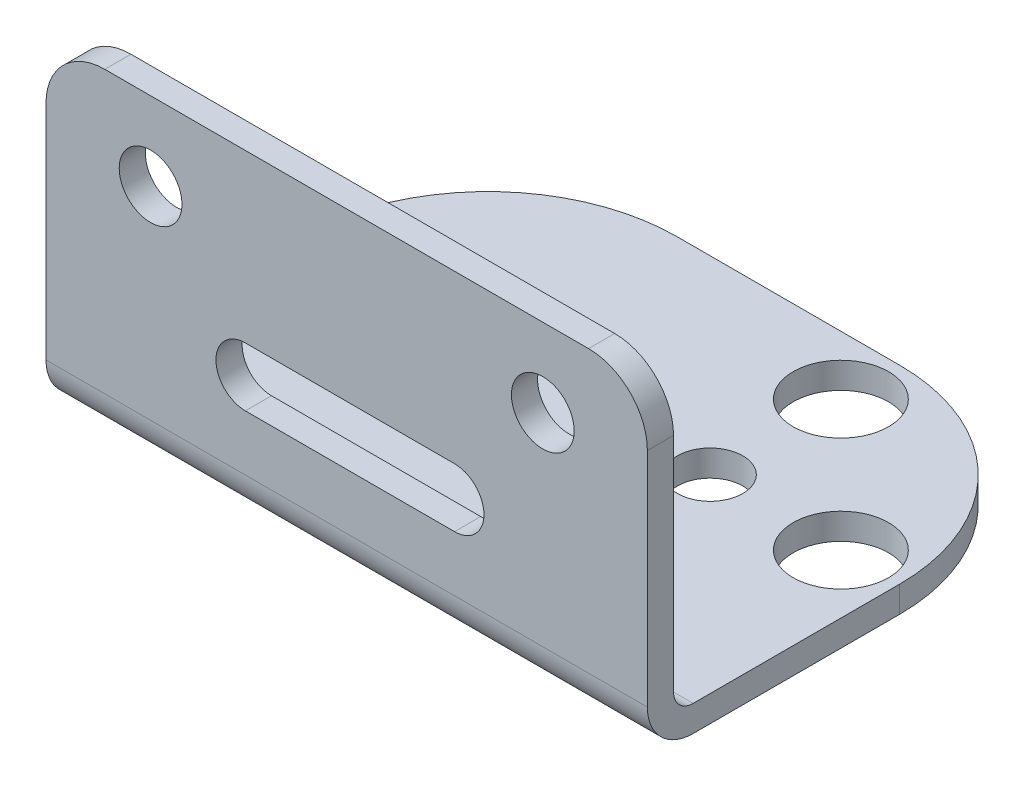
ISO-10303-21;
HEADER;
FILE_DESCRIPTION(('STEP AP214'),'2;1');
FILE_NAME('part.step','',(''),(''),'','','');
FILE_SCHEMA(('AUTOMOTIVE_DESIGN { 1 0 10303 214 1 1 1 1 }'));
ENDSEC;
DATA;
#1=APPLICATION_CONTEXT('core data for automotive mechanical design processes');
#2=APPLICATION_PROTOCOL_DEFINITION('international standard','automotive_design',2000,#1);
#3=PRODUCT_CONTEXT('',#1,'mechanical');
#4=PRODUCT('Part','Part','',(#3));
#5=PRODUCT_RELATED_PRODUCT_CATEGORY('part','',(#4));
#6=PRODUCT_DEFINITION_FORMATION('','',#4);
#7=PRODUCT_DEFINITION_CONTEXT('part definition',#1,'design');
#8=PRODUCT_DEFINITION('design','',#6,#7);
#9=PRODUCT_DEFINITION_SHAPE('','',#8);
#10=(LENGTH_UNIT() NAMED_UNIT(*) SI_UNIT(.MILLI.,.METRE.));
#11=(NAMED_UNIT(*) PLANE_ANGLE_UNIT() SI_UNIT($,.RADIAN.));
#12=(NAMED_UNIT(*) SI_UNIT($,.STERADIAN.) SOLID_ANGLE_UNIT());
#13=UNCERTAINTY_MEASURE_WITH_UNIT(LENGTH_MEASURE(1.E-05),#10,'distance_accuracy_value','');
#14=(GEOMETRIC_REPRESENTATION_CONTEXT(3) GLOBAL_UNCERTAINTY_ASSIGNED_CONTEXT((#13)) GLOBAL_UNIT_ASSIGNED_CONTEXT((#10,
#11,#12)) REPRESENTATION_CONTEXT('',''));
#15=CARTESIAN_POINT('',(0.,0.,0.));
#16=DIRECTION('',(0.,0.,1.));
#17=DIRECTION('',(1.,0.,0.));
#18=AXIS2_PLACEMENT_3D('',#15,#16,#17);
#19=CARTESIAN_POINT('',(0.,2.,-33.8));
#20=DIRECTION('',(1.,0.,0.));
#21=DIRECTION('',(0.,0.,-1.));
#22=AXIS2_PLACEMENT_3D('',#19,#20,#21);
#23=PLANE('',#22);
#24=DIRECTION('',(0.,0.,1.));
#25=VECTOR('',#24,1.);
#26=CARTESIAN_POINT('',(0.,0.,-33.8));
#27=LINE('',#26,#25);
#28=CARTESIAN_POINT('',(0.,0.,-19.3));
#29=VERTEX_POINT('',#28);
#30=CARTESIAN_POINT('',(0.,0.,-3.5));
#31=VERTEX_POINT('',#30);
#32=EDGE_CURVE('E253',#29,#31,#27,.T.);
#33=ORIENTED_EDGE('',*,*,#32,.T.);
#34=CARTESIAN_POINT('',(0.,3.5,-3.5));
#35=DIRECTION('',(1.,0.,0.));
#36=DIRECTION('',(0.,0.,-1.));
#37=AXIS2_PLACEMENT_3D('',#34,#35,#36);
#38=CIRCLE('',#37,3.5);
#39=CARTESIAN_POINT('',(0.,3.5,0.));
#40=VERTEX_POINT('',#39);
#41=EDGE_CURVE('E350',#31,#40,#38,.F.);
#42=ORIENTED_EDGE('',*,*,#41,.T.);
#43=DIRECTION('',(0.,-1.,0.));
#44=VECTOR('',#43,1.);
#45=CARTESIAN_POINT('',(0.,2.,0.));
#46=LINE('',#45,#44);
#47=CARTESIAN_POINT('',(0.,20.5,0.));
#48=VERTEX_POINT('',#47);
#49=EDGE_CURVE('E282',#48,#40,#46,.T.);
#50=ORIENTED_EDGE('',*,*,#49,.F.);
#51=DIRECTION('',(0.,0.,-1.));
#52=VECTOR('',#51,1.);
#53=CARTESIAN_POINT('',(0.,20.5,-2.00000000000001));
#54=LINE('',#53,#52);
#55=CARTESIAN_POINT('',(0.,20.5,-2.00000000000001));
#56=VERTEX_POINT('',#55);
#57=EDGE_CURVE('E314',#48,#56,#54,.T.);
#58=ORIENTED_EDGE('',*,*,#57,.T.);
#59=DIRECTION('',(0.,-1.,0.));
#60=VECTOR('',#59,1.);
#61=CARTESIAN_POINT('',(0.,25.,-2.00000000000001));
#62=LINE('',#61,#60);
#63=CARTESIAN_POINT('',(0.,3.5,-2.00000000000001));
#64=VERTEX_POINT('',#63);
#65=EDGE_CURVE('E208',#56,#64,#62,.T.);
#66=ORIENTED_EDGE('',*,*,#65,.T.);
#67=CARTESIAN_POINT('',(0.,3.5,-3.50000000000001));
#68=DIRECTION('',(1.,0.,0.));
#69=DIRECTION('',(0.,0.,-1.));
#70=AXIS2_PLACEMENT_3D('',#67,#68,#69);
#71=CIRCLE('',#70,1.5);
#72=CARTESIAN_POINT('',(0.,2.,-3.50000000000001));
#73=VERTEX_POINT('',#72);
#74=EDGE_CURVE('E360',#64,#73,#71,.T.);
#75=ORIENTED_EDGE('',*,*,#74,.T.);
#76=DIRECTION('',(0.,0.,1.));
#77=VECTOR('',#76,1.);
#78=CARTESIAN_POINT('',(0.,2.,-33.8));
#79=LINE('',#78,#77);
#80=CARTESIAN_POINT('',(0.,2.,-19.3));
#81=VERTEX_POINT('',#80);
#82=EDGE_CURVE('E257',#81,#73,#79,.T.);
#83=ORIENTED_EDGE('',*,*,#82,.F.);
#84=DIRECTION('',(0.,-1.,0.));
#85=VECTOR('',#84,1.);
#86=CARTESIAN_POINT('',(0.,2.,-19.3));
#87=LINE('',#86,#85);
#88=EDGE_CURVE('E286',#81,#29,#87,.T.);
#89=ORIENTED_EDGE('',*,*,#88,.T.);
#90=EDGE_LOOP('',(#33,#42,#50,#58,#66,#75,#83,#89));
#91=FACE_BOUND('',#90,.T.);
#92=ADVANCED_FACE('F42',(#91),#23,.F.);
#93=CARTESIAN_POINT('',(0.,2.,0.));
#94=DIRECTION('',(0.,0.,-1.));
#95=DIRECTION('',(-1.,0.,0.));
#96=AXIS2_PLACEMENT_3D('',#93,#94,#95);
#97=PLANE('',#96);
#98=DIRECTION('',(1.,0.,0.));
#99=VECTOR('',#98,1.);
#100=CARTESIAN_POINT('',(15.25,7.75,0.));
#101=LINE('',#100,#99);
#102=CARTESIAN_POINT('',(15.25,7.75,0.));
#103=VERTEX_POINT('',#102);
#104=CARTESIAN_POINT('',(31.25,7.75,0.));
#105=VERTEX_POINT('',#104);
#106=EDGE_CURVE('E168',#103,#105,#101,.T.);
#107=ORIENTED_EDGE('',*,*,#106,.F.);
#108=CARTESIAN_POINT('',(15.25,10.,0.));
#109=DIRECTION('',(0.,0.,1.));
#110=DIRECTION('',(-1.,0.,0.));
#111=AXIS2_PLACEMENT_3D('',#108,#109,#110);
#112=CIRCLE('',#111,2.25);
#113=CARTESIAN_POINT('',(15.25,12.25,0.));
#114=VERTEX_POINT('',#113);
#115=EDGE_CURVE('E58',#114,#103,#112,.T.);
#116=ORIENTED_EDGE('',*,*,#115,.F.);
#117=DIRECTION('',(-1.,0.,0.));
#118=VECTOR('',#117,1.);
#119=CARTESIAN_POINT('',(15.25,12.25,0.));
#120=LINE('',#119,#118);
#121=CARTESIAN_POINT('',(31.25,12.25,0.));
#122=VERTEX_POINT('',#121);
#123=EDGE_CURVE('E176',#122,#114,#120,.T.);
#124=ORIENTED_EDGE('',*,*,#123,.F.);
#125=CARTESIAN_POINT('',(31.25,10.,0.));
#126=DIRECTION('',(0.,0.,1.));
#127=DIRECTION('',(-1.,0.,0.));
#128=AXIS2_PLACEMENT_3D('',#125,#126,#127);
#129=CIRCLE('',#128,2.25);
#130=EDGE_CURVE('E158',#105,#122,#129,.T.);
#131=ORIENTED_EDGE('',*,*,#130,.F.);
#132=EDGE_LOOP('',(#107,#116,#124,#131));
#133=FACE_BOUND('',#132,.T.);
#134=CARTESIAN_POINT('',(38.,19.,0.));
#135=DIRECTION('',(0.,0.,1.));
#136=DIRECTION('',(-1.,0.,0.));
#137=AXIS2_PLACEMENT_3D('',#134,#135,#136);
#138=CIRCLE('',#137,2.4);
#139=CARTESIAN_POINT('',(35.6,19.,0.));
#140=VERTEX_POINT('',#139);
#141=EDGE_CURVE('E191',#140,#140,#138,.T.);
#142=ORIENTED_EDGE('',*,*,#141,.F.);
#143=EDGE_LOOP('',(#142));
#144=FACE_BOUND('',#143,.T.);
#145=CARTESIAN_POINT('',(8.,19.,0.));
#146=DIRECTION('',(0.,0.,1.));
#147=DIRECTION('',(-1.,0.,0.));
#148=AXIS2_PLACEMENT_3D('',#145,#146,#147);
#149=CIRCLE('',#148,2.4);
#150=CARTESIAN_POINT('',(5.6,19.,0.));
#151=VERTEX_POINT('',#150);
#152=EDGE_CURVE('E195',#151,#151,#149,.T.);
#153=ORIENTED_EDGE('',*,*,#152,.F.);
#154=EDGE_LOOP('',(#153));
#155=FACE_BOUND('',#154,.T.);
#156=ORIENTED_EDGE('',*,*,#49,.T.);
#157=DIRECTION('',(1.,0.,0.));
#158=VECTOR('',#157,1.);
#159=CARTESIAN_POINT('',(0.,3.5,0.));
#160=LINE('',#159,#158);
#161=CARTESIAN_POINT('',(46.,3.5,0.));
#162=VERTEX_POINT('',#161);
#163=EDGE_CURVE('E340',#40,#162,#160,.T.);
#164=ORIENTED_EDGE('',*,*,#163,.T.);
#165=DIRECTION('',(0.,-1.,0.));
#166=VECTOR('',#165,1.);
#167=CARTESIAN_POINT('',(46.,2.,0.));
#168=LINE('',#167,#166);
#169=CARTESIAN_POINT('',(46.,20.5,0.));
#170=VERTEX_POINT('',#169);
#171=EDGE_CURVE('E269',#170,#162,#168,.T.);
#172=ORIENTED_EDGE('',*,*,#171,.F.);
#173=CARTESIAN_POINT('',(41.5,20.5,0.));
#174=DIRECTION('',(0.,0.,-1.));
#175=DIRECTION('',(-1.,0.,0.));
#176=AXIS2_PLACEMENT_3D('',#173,#174,#175);
#177=CIRCLE('',#176,4.5);
#178=CARTESIAN_POINT('',(41.5,25.,0.));
#179=VERTEX_POINT('',#178);
#180=EDGE_CURVE('E330',#170,#179,#177,.F.);
#181=ORIENTED_EDGE('',*,*,#180,.T.);
#182=DIRECTION('',(-1.,0.,0.));
#183=VECTOR('',#182,1.);
#184=CARTESIAN_POINT('',(0.,25.,0.));
#185=LINE('',#184,#183);
#186=CARTESIAN_POINT('',(4.5,25.,0.));
#187=VERTEX_POINT('',#186);
#188=EDGE_CURVE('E203',#179,#187,#185,.T.);
#189=ORIENTED_EDGE('',*,*,#188,.T.);
#190=CARTESIAN_POINT('',(4.5,20.5,0.));
#191=DIRECTION('',(0.,0.,-1.));
#192=DIRECTION('',(-1.,0.,0.));
#193=AXIS2_PLACEMENT_3D('',#190,#191,#192);
#194=CIRCLE('',#193,4.5);
#195=EDGE_CURVE('E333',#187,#48,#194,.F.);
#196=ORIENTED_EDGE('',*,*,#195,.T.);
#197=EDGE_LOOP('',(#156,#164,#172,#181,#189,#196));
#198=FACE_BOUND('',#197,.T.);
#199=ADVANCED_FACE('F173',(#133,#144,#155,#198),#97,.F.);
#200=CARTESIAN_POINT('',(46.,2.,0.));
#201=DIRECTION('',(-1.,0.,0.));
#202=DIRECTION('',(0.,0.,1.));
#203=AXIS2_PLACEMENT_3D('',#200,#201,#202);
#204=PLANE('',#203);
#205=ORIENTED_EDGE('',*,*,#171,.T.);
#206=CARTESIAN_POINT('',(46.,3.5,-3.5));
#207=DIRECTION('',(-1.,0.,0.));
#208=DIRECTION('',(0.,0.,1.));
#209=AXIS2_PLACEMENT_3D('',#206,#207,#208);
#210=CIRCLE('',#209,3.5);
#211=CARTESIAN_POINT('',(46.,0.,-3.5));
#212=VERTEX_POINT('',#211);
#213=EDGE_CURVE('E344',#162,#212,#210,.F.);
#214=ORIENTED_EDGE('',*,*,#213,.T.);
#215=DIRECTION('',(0.,0.,-1.));
#216=VECTOR('',#215,1.);
#217=CARTESIAN_POINT('',(46.,0.,0.));
#218=LINE('',#217,#216);
#219=CARTESIAN_POINT('',(46.,0.,-19.3));
#220=VERTEX_POINT('',#219);
#221=EDGE_CURVE('E273',#212,#220,#218,.T.);
#222=ORIENTED_EDGE('',*,*,#221,.T.);
#223=DIRECTION('',(0.,-1.,0.));
#224=VECTOR('',#223,1.);
#225=CARTESIAN_POINT('',(46.,2.,-19.3));
#226=LINE('',#225,#224);
#227=CARTESIAN_POINT('',(46.,2.,-19.3));
#228=VERTEX_POINT('',#227);
#229=EDGE_CURVE('E310',#220,#228,#226,.F.);
#230=ORIENTED_EDGE('',*,*,#229,.T.);
#231=DIRECTION('',(0.,0.,-1.));
#232=VECTOR('',#231,1.);
#233=CARTESIAN_POINT('',(46.,2.,0.));
#234=LINE('',#233,#232);
#235=CARTESIAN_POINT('',(46.,2.,-3.5));
#236=VERTEX_POINT('',#235);
#237=EDGE_CURVE('E261',#236,#228,#234,.T.);
#238=ORIENTED_EDGE('',*,*,#237,.F.);
#239=CARTESIAN_POINT('',(46.,3.5,-3.5));
#240=DIRECTION('',(-1.,0.,0.));
#241=DIRECTION('',(0.,0.,1.));
#242=AXIS2_PLACEMENT_3D('',#239,#240,#241);
#243=CIRCLE('',#242,1.5);
#244=CARTESIAN_POINT('',(46.,3.5,-2.));
#245=VERTEX_POINT('',#244);
#246=EDGE_CURVE('E363',#236,#245,#243,.T.);
#247=ORIENTED_EDGE('',*,*,#246,.T.);
#248=DIRECTION('',(0.,-1.,0.));
#249=VECTOR('',#248,1.);
#250=CARTESIAN_POINT('',(46.,25.,-2.));
#251=LINE('',#250,#249);
#252=CARTESIAN_POINT('',(46.,20.5,-2.));
#253=VERTEX_POINT('',#252);
#254=EDGE_CURVE('E209',#253,#245,#251,.T.);
#255=ORIENTED_EDGE('',*,*,#254,.F.);
#256=DIRECTION('',(0.,0.,1.));
#257=VECTOR('',#256,1.);
#258=CARTESIAN_POINT('',(46.,20.5,0.));
#259=LINE('',#258,#257);
#260=EDGE_CURVE('E336',#253,#170,#259,.T.);
#261=ORIENTED_EDGE('',*,*,#260,.T.);
#262=EDGE_LOOP('',(#205,#214,#222,#230,#238,#247,#255,#261));
#263=FACE_BOUND('',#262,.T.);
#264=ADVANCED_FACE('F405',(#263),#204,.F.);
#265=CARTESIAN_POINT('',(46.,2.,-33.8));
#266=DIRECTION('',(0.,0.,1.));
#267=DIRECTION('',(1.,0.,0.));
#268=AXIS2_PLACEMENT_3D('',#265,#266,#267);
#269=PLANE('',#268);
#270=DIRECTION('',(-1.,0.,0.));
#271=VECTOR('',#270,1.);
#272=CARTESIAN_POINT('',(46.,0.,-33.8));
#273=LINE('',#272,#271);
#274=CARTESIAN_POINT('',(31.5,0.,-33.8));
#275=VERTEX_POINT('',#274);
#276=CARTESIAN_POINT('',(14.5,0.,-33.8));
#277=VERTEX_POINT('',#276);
#278=EDGE_CURVE('E262',#275,#277,#273,.T.);
#279=ORIENTED_EDGE('',*,*,#278,.T.);
#280=DIRECTION('',(0.,-1.,0.));
#281=VECTOR('',#280,1.);
#282=CARTESIAN_POINT('',(14.5,2.,-33.8));
#283=LINE('',#282,#281);
#284=CARTESIAN_POINT('',(14.5,2.,-33.8));
#285=VERTEX_POINT('',#284);
#286=EDGE_CURVE('E301',#277,#285,#283,.F.);
#287=ORIENTED_EDGE('',*,*,#286,.T.);
#288=DIRECTION('',(-1.,0.,0.));
#289=VECTOR('',#288,1.);
#290=CARTESIAN_POINT('',(46.,2.,-33.8));
#291=LINE('',#290,#289);
#292=CARTESIAN_POINT('',(31.5,2.,-33.8));
#293=VERTEX_POINT('',#292);
#294=EDGE_CURVE('E265',#293,#285,#291,.T.);
#295=ORIENTED_EDGE('',*,*,#294,.F.);
#296=DIRECTION('',(0.,-1.,0.));
#297=VECTOR('',#296,1.);
#298=CARTESIAN_POINT('',(31.5,2.,-33.8));
#299=LINE('',#298,#297);
#300=EDGE_CURVE('E297',#293,#275,#299,.T.);
#301=ORIENTED_EDGE('',*,*,#300,.T.);
#302=EDGE_LOOP('',(#279,#287,#295,#301));
#303=FACE_BOUND('',#302,.T.);
#304=ADVANCED_FACE('F473',(#303),#269,.F.);
#305=CARTESIAN_POINT('',(0.,2.,0.));
#306=DIRECTION('',(0.,1.,0.));
#307=DIRECTION('',(0.,0.,1.));
#308=AXIS2_PLACEMENT_3D('',#305,#306,#307);
#309=PLANE('',#308);
#310=ORIENTED_EDGE('',*,*,#82,.T.);
#311=DIRECTION('',(-1.,0.,0.));
#312=VECTOR('',#311,1.);
#313=CARTESIAN_POINT('',(46.,2.,-3.5));
#314=LINE('',#313,#312);
#315=EDGE_CURVE('E357',#73,#236,#314,.F.);
#316=ORIENTED_EDGE('',*,*,#315,.T.);
#317=ORIENTED_EDGE('',*,*,#237,.T.);
#318=CARTESIAN_POINT('',(31.5,2.,-19.3));
#319=DIRECTION('',(0.,1.,0.));
#320=DIRECTION('',(0.,0.,1.));
#321=AXIS2_PLACEMENT_3D('',#318,#319,#320);
#322=CIRCLE('',#321,14.5);
#323=EDGE_CURVE('E304',#228,#293,#322,.T.);
#324=ORIENTED_EDGE('',*,*,#323,.T.);
#325=ORIENTED_EDGE('',*,*,#294,.T.);
#326=CARTESIAN_POINT('',(14.5,2.,-19.3));
#327=DIRECTION('',(0.,1.,0.));
#328=DIRECTION('',(0.,0.,1.));
#329=AXIS2_PLACEMENT_3D('',#326,#327,#328);
#330=CIRCLE('',#329,14.5);
#331=EDGE_CURVE('E307',#285,#81,#330,.T.);
#332=ORIENTED_EDGE('',*,*,#331,.T.);
#333=EDGE_LOOP('',(#310,#316,#317,#324,#325,#332));
#334=FACE_BOUND('',#333,.T.);
#335=CARTESIAN_POINT('',(41.5,2.,-19.3));
#336=DIRECTION('',(0.,1.,0.));
#337=DIRECTION('',(0.,0.,1.));
#338=AXIS2_PLACEMENT_3D('',#335,#336,#337);
#339=CIRCLE('',#338,3.65);
#340=CARTESIAN_POINT('',(41.5,2.,-15.65));
#341=VERTEX_POINT('',#340);
#342=EDGE_CURVE('E233',#341,#341,#339,.T.);
#343=ORIENTED_EDGE('',*,*,#342,.F.);
#344=EDGE_LOOP('',(#343));
#345=FACE_BOUND('',#344,.T.);
#346=CARTESIAN_POINT('',(31.5,2.,-9.3));
#347=DIRECTION('',(0.,1.,0.));
#348=DIRECTION('',(0.,0.,1.));
#349=AXIS2_PLACEMENT_3D('',#346,#347,#348);
#350=CIRCLE('',#349,3.65);
#351=CARTESIAN_POINT('',(31.5,2.,-5.65));
#352=VERTEX_POINT('',#351);
#353=EDGE_CURVE('E242',#352,#352,#350,.T.);
#354=ORIENTED_EDGE('',*,*,#353,.F.);
#355=EDGE_LOOP('',(#354));
#356=FACE_BOUND('',#355,.T.);
#357=CARTESIAN_POINT('',(11.5,2.,-19.3));
#358=DIRECTION('',(0.,1.,0.));
#359=DIRECTION('',(0.,0.,1.));
#360=AXIS2_PLACEMENT_3D('',#357,#358,#359);
#361=CIRCLE('',#360,3.65);
#362=CARTESIAN_POINT('',(11.5,2.,-15.65));
#363=VERTEX_POINT('',#362);
#364=EDGE_CURVE('E217',#363,#363,#361,.T.);
#365=ORIENTED_EDGE('',*,*,#364,.F.);
#366=EDGE_LOOP('',(#365));
#367=FACE_BOUND('',#366,.T.);
#368=CARTESIAN_POINT('',(31.5,2.,-29.3));
#369=DIRECTION('',(0.,1.,0.));
#370=DIRECTION('',(0.,0.,1.));
#371=AXIS2_PLACEMENT_3D('',#368,#369,#370);
#372=CIRCLE('',#371,3.65);
#373=CARTESIAN_POINT('',(31.5,2.,-25.65));
#374=VERTEX_POINT('',#373);
#375=EDGE_CURVE('E226',#374,#374,#372,.T.);
#376=ORIENTED_EDGE('',*,*,#375,.F.);
#377=EDGE_LOOP('',(#376));
#378=FACE_BOUND('',#377,.T.);
#379=CARTESIAN_POINT('',(31.5,2.,-19.3));
#380=DIRECTION('',(0.,1.,0.));
#381=DIRECTION('',(0.,0.,1.));
#382=AXIS2_PLACEMENT_3D('',#379,#380,#381);
#383=CIRCLE('',#382,2.5);
#384=CARTESIAN_POINT('',(31.5,2.,-16.8));
#385=VERTEX_POINT('',#384);
#386=EDGE_CURVE('E237',#385,#385,#383,.T.);
#387=ORIENTED_EDGE('',*,*,#386,.F.);
#388=EDGE_LOOP('',(#387));
#389=FACE_BOUND('',#388,.T.);
#390=ADVANCED_FACE('F455',(#334,#345,#356,#367,#378,#389),#309,.T.);
#391=CARTESIAN_POINT('',(0.,0.,0.));
#392=DIRECTION('',(0.,1.,0.));
#393=DIRECTION('',(0.,0.,1.));
#394=AXIS2_PLACEMENT_3D('',#391,#392,#393);
#395=PLANE('',#394);
#396=CARTESIAN_POINT('',(41.5,0.,-19.3));
#397=DIRECTION('',(0.,1.,0.));
#398=DIRECTION('',(0.,0.,1.));
#399=AXIS2_PLACEMENT_3D('',#396,#397,#398);
#400=CIRCLE('',#399,3.65);
#401=CARTESIAN_POINT('',(41.5,0.,-15.65));
#402=VERTEX_POINT('',#401);
#403=EDGE_CURVE('E238',#402,#402,#400,.T.);
#404=ORIENTED_EDGE('',*,*,#403,.T.);
#405=EDGE_LOOP('',(#404));
#406=FACE_BOUND('',#405,.T.);
#407=CARTESIAN_POINT('',(31.5,0.,-9.3));
#408=DIRECTION('',(0.,1.,0.));
#409=DIRECTION('',(0.,0.,1.));
#410=AXIS2_PLACEMENT_3D('',#407,#408,#409);
#411=CIRCLE('',#410,3.65);
#412=CARTESIAN_POINT('',(31.5,0.,-5.65));
#413=VERTEX_POINT('',#412);
#414=EDGE_CURVE('E221',#413,#413,#411,.T.);
#415=ORIENTED_EDGE('',*,*,#414,.T.);
#416=EDGE_LOOP('',(#415));
#417=FACE_BOUND('',#416,.T.);
#418=CARTESIAN_POINT('',(11.5,0.,-19.3));
#419=DIRECTION('',(0.,1.,0.));
#420=DIRECTION('',(0.,0.,1.));
#421=AXIS2_PLACEMENT_3D('',#418,#419,#420);
#422=CIRCLE('',#421,3.65);
#423=CARTESIAN_POINT('',(11.5,0.,-15.65));
#424=VERTEX_POINT('',#423);
#425=EDGE_CURVE('E222',#424,#424,#422,.T.);
#426=ORIENTED_EDGE('',*,*,#425,.T.);
#427=EDGE_LOOP('',(#426));
#428=FACE_BOUND('',#427,.T.);
#429=CARTESIAN_POINT('',(31.5,0.,-29.3));
#430=DIRECTION('',(0.,1.,0.));
#431=DIRECTION('',(0.,0.,1.));
#432=AXIS2_PLACEMENT_3D('',#429,#430,#431);
#433=CIRCLE('',#432,3.65);
#434=CARTESIAN_POINT('',(31.5,0.,-25.65));
#435=VERTEX_POINT('',#434);
#436=EDGE_CURVE('E213',#435,#435,#433,.T.);
#437=ORIENTED_EDGE('',*,*,#436,.T.);
#438=EDGE_LOOP('',(#437));
#439=FACE_BOUND('',#438,.T.);
#440=CARTESIAN_POINT('',(31.5,0.,-19.3));
#441=DIRECTION('',(0.,1.,0.));
#442=DIRECTION('',(0.,0.,1.));
#443=AXIS2_PLACEMENT_3D('',#440,#441,#442);
#444=CIRCLE('',#443,2.5);
#445=CARTESIAN_POINT('',(31.5,0.,-16.8));
#446=VERTEX_POINT('',#445);
#447=EDGE_CURVE('E249',#446,#446,#444,.T.);
#448=ORIENTED_EDGE('',*,*,#447,.T.);
#449=EDGE_LOOP('',(#448));
#450=FACE_BOUND('',#449,.T.);
#451=ORIENTED_EDGE('',*,*,#221,.F.);
#452=DIRECTION('',(1.,0.,0.));
#453=VECTOR('',#452,1.);
#454=CARTESIAN_POINT('',(0.,0.,-3.5));
#455=LINE('',#454,#453);
#456=EDGE_CURVE('E347',#212,#31,#455,.F.);
#457=ORIENTED_EDGE('',*,*,#456,.T.);
#458=ORIENTED_EDGE('',*,*,#32,.F.);
#459=CARTESIAN_POINT('',(14.5,0.,-19.3));
#460=DIRECTION('',(0.,1.,0.));
#461=DIRECTION('',(0.,0.,1.));
#462=AXIS2_PLACEMENT_3D('',#459,#460,#461);
#463=CIRCLE('',#462,14.5);
#464=EDGE_CURVE('E294',#29,#277,#463,.F.);
#465=ORIENTED_EDGE('',*,*,#464,.T.);
#466=ORIENTED_EDGE('',*,*,#278,.F.);
#467=CARTESIAN_POINT('',(31.5,0.,-19.3));
#468=DIRECTION('',(0.,1.,0.));
#469=DIRECTION('',(0.,0.,1.));
#470=AXIS2_PLACEMENT_3D('',#467,#468,#469);
#471=CIRCLE('',#470,14.5);
#472=EDGE_CURVE('E290',#275,#220,#471,.F.);
#473=ORIENTED_EDGE('',*,*,#472,.T.);
#474=EDGE_LOOP('',(#451,#457,#458,#465,#466,#473));
#475=FACE_BOUND('',#474,.T.);
#476=ADVANCED_FACE('F413',(#406,#417,#428,#439,#450,#475),#395,.F.);
#477=CARTESIAN_POINT('',(14.5,2.,-19.3));
#478=DIRECTION('',(0.,-1.,0.));
#479=DIRECTION('',(0.,0.,-1.));
#480=AXIS2_PLACEMENT_3D('',#477,#478,#479);
#481=CYLINDRICAL_SURFACE('',#480,14.5);
#482=ORIENTED_EDGE('',*,*,#331,.F.);
#483=ORIENTED_EDGE('',*,*,#286,.F.);
#484=ORIENTED_EDGE('',*,*,#464,.F.);
#485=ORIENTED_EDGE('',*,*,#88,.F.);
#486=EDGE_LOOP('',(#482,#483,#484,#485));
#487=FACE_BOUND('',#486,.T.);
#488=ADVANCED_FACE('F409',(#487),#481,.T.);
#489=CARTESIAN_POINT('',(31.5,2.,-19.3));
#490=DIRECTION('',(0.,-1.,0.));
#491=DIRECTION('',(0.,0.,-1.));
#492=AXIS2_PLACEMENT_3D('',#489,#490,#491);
#493=CYLINDRICAL_SURFACE('',#492,14.5);
#494=ORIENTED_EDGE('',*,*,#323,.F.);
#495=ORIENTED_EDGE('',*,*,#229,.F.);
#496=ORIENTED_EDGE('',*,*,#472,.F.);
#497=ORIENTED_EDGE('',*,*,#300,.F.);
#498=EDGE_LOOP('',(#494,#495,#496,#497));
#499=FACE_BOUND('',#498,.T.);
#500=ADVANCED_FACE('F412',(#499),#493,.T.);
#501=CARTESIAN_POINT('',(31.5,0.,-19.3));
#502=DIRECTION('',(0.,1.,0.));
#503=DIRECTION('',(0.,0.,1.));
#504=AXIS2_PLACEMENT_3D('',#501,#502,#503);
#505=CYLINDRICAL_SURFACE('',#504,2.5);
#506=ORIENTED_EDGE('',*,*,#447,.F.);
#507=EDGE_LOOP('',(#506));
#508=FACE_BOUND('',#507,.T.);
#509=ORIENTED_EDGE('',*,*,#386,.T.);
#510=EDGE_LOOP('',(#509));
#511=FACE_BOUND('',#510,.T.);
#512=ADVANCED_FACE('F417',(#508,#511),#505,.F.);
#513=CARTESIAN_POINT('',(31.5,0.,-29.3));
#514=DIRECTION('',(0.,1.,0.));
#515=DIRECTION('',(0.,0.,1.));
#516=AXIS2_PLACEMENT_3D('',#513,#514,#515);
#517=CYLINDRICAL_SURFACE('',#516,3.65);
#518=ORIENTED_EDGE('',*,*,#436,.F.);
#519=EDGE_LOOP('',(#518));
#520=FACE_BOUND('',#519,.T.);
#521=ORIENTED_EDGE('',*,*,#375,.T.);
#522=EDGE_LOOP('',(#521));
#523=FACE_BOUND('',#522,.T.);
#524=ADVANCED_FACE('F487',(#520,#523),#517,.F.);
#525=CARTESIAN_POINT('',(11.5,0.,-19.3));
#526=DIRECTION('',(0.,1.,0.));
#527=DIRECTION('',(0.,0.,1.));
#528=AXIS2_PLACEMENT_3D('',#525,#526,#527);
#529=CYLINDRICAL_SURFACE('',#528,3.65);
#530=ORIENTED_EDGE('',*,*,#425,.F.);
#531=EDGE_LOOP('',(#530));
#532=FACE_BOUND('',#531,.T.);
#533=ORIENTED_EDGE('',*,*,#364,.T.);
#534=EDGE_LOOP('',(#533));
#535=FACE_BOUND('',#534,.T.);
#536=ADVANCED_FACE('F493',(#532,#535),#529,.F.);
#537=CARTESIAN_POINT('',(31.5,0.,-9.3));
#538=DIRECTION('',(0.,1.,0.));
#539=DIRECTION('',(0.,0.,1.));
#540=AXIS2_PLACEMENT_3D('',#537,#538,#539);
#541=CYLINDRICAL_SURFACE('',#540,3.65);
#542=ORIENTED_EDGE('',*,*,#414,.F.);
#543=EDGE_LOOP('',(#542));
#544=FACE_BOUND('',#543,.T.);
#545=ORIENTED_EDGE('',*,*,#353,.T.);
#546=EDGE_LOOP('',(#545));
#547=FACE_BOUND('',#546,.T.);
#548=ADVANCED_FACE('F489',(#544,#547),#541,.F.);
#549=CARTESIAN_POINT('',(41.5,0.,-19.3));
#550=DIRECTION('',(0.,1.,0.));
#551=DIRECTION('',(0.,0.,1.));
#552=AXIS2_PLACEMENT_3D('',#549,#550,#551);
#553=CYLINDRICAL_SURFACE('',#552,3.65);
#554=ORIENTED_EDGE('',*,*,#403,.F.);
#555=EDGE_LOOP('',(#554));
#556=FACE_BOUND('',#555,.T.);
#557=ORIENTED_EDGE('',*,*,#342,.T.);
#558=EDGE_LOOP('',(#557));
#559=FACE_BOUND('',#558,.T.);
#560=ADVANCED_FACE('F492',(#556,#559),#553,.F.);
#561=CARTESIAN_POINT('',(46.,25.,-2.));
#562=DIRECTION('',(0.,0.,-1.));
#563=DIRECTION('',(-1.,0.,0.));
#564=AXIS2_PLACEMENT_3D('',#561,#562,#563);
#565=PLANE('',#564);
#566=CARTESIAN_POINT('',(15.25,10.,-2.00000000000001));
#567=DIRECTION('',(0.,0.,-1.));
#568=DIRECTION('',(-1.,0.,0.));
#569=AXIS2_PLACEMENT_3D('',#566,#567,#568);
#570=CIRCLE('',#569,2.25);
#571=CARTESIAN_POINT('',(15.25,7.75,-2.));
#572=VERTEX_POINT('',#571);
#573=CARTESIAN_POINT('',(15.25,12.25,-2.));
#574=VERTEX_POINT('',#573);
#575=EDGE_CURVE('E11',#572,#574,#570,.T.);
#576=ORIENTED_EDGE('',*,*,#575,.F.);
#577=DIRECTION('',(-1.,0.,0.));
#578=VECTOR('',#577,1.);
#579=CARTESIAN_POINT('',(46.,7.75,-2.));
#580=LINE('',#579,#578);
#581=CARTESIAN_POINT('',(31.25,7.75,-2.));
#582=VERTEX_POINT('',#581);
#583=EDGE_CURVE('E366',#582,#572,#580,.T.);
#584=ORIENTED_EDGE('',*,*,#583,.F.);
#585=CARTESIAN_POINT('',(31.25,10.,-2.00000000000001));
#586=DIRECTION('',(0.,0.,-1.));
#587=DIRECTION('',(-1.,0.,0.));
#588=AXIS2_PLACEMENT_3D('',#585,#586,#587);
#589=CIRCLE('',#588,2.25);
#590=CARTESIAN_POINT('',(31.25,12.25,-2.00000000000001));
#591=VERTEX_POINT('',#590);
#592=EDGE_CURVE('E161',#591,#582,#589,.T.);
#593=ORIENTED_EDGE('',*,*,#592,.F.);
#594=DIRECTION('',(1.,0.,0.));
#595=VECTOR('',#594,1.);
#596=CARTESIAN_POINT('',(46.,12.25,-2.));
#597=LINE('',#596,#595);
#598=EDGE_CURVE('E51',#574,#591,#597,.T.);
#599=ORIENTED_EDGE('',*,*,#598,.F.);
#600=EDGE_LOOP('',(#576,#584,#593,#599));
#601=FACE_BOUND('',#600,.T.);
#602=CARTESIAN_POINT('',(38.,19.,-2.));
#603=DIRECTION('',(0.,0.,-1.));
#604=DIRECTION('',(-1.,0.,0.));
#605=AXIS2_PLACEMENT_3D('',#602,#603,#604);
#606=CIRCLE('',#605,2.4);
#607=CARTESIAN_POINT('',(35.6,19.,-2.));
#608=VERTEX_POINT('',#607);
#609=EDGE_CURVE('E204',#608,#608,#606,.T.);
#610=ORIENTED_EDGE('',*,*,#609,.F.);
#611=EDGE_LOOP('',(#610));
#612=FACE_BOUND('',#611,.T.);
#613=CARTESIAN_POINT('',(8.,19.,-2.00000000000001));
#614=DIRECTION('',(0.,0.,-1.));
#615=DIRECTION('',(-1.,0.,0.));
#616=AXIS2_PLACEMENT_3D('',#613,#614,#615);
#617=CIRCLE('',#616,2.4);
#618=CARTESIAN_POINT('',(5.6,19.,-2.00000000000001));
#619=VERTEX_POINT('',#618);
#620=EDGE_CURVE('E186',#619,#619,#617,.T.);
#621=ORIENTED_EDGE('',*,*,#620,.F.);
#622=EDGE_LOOP('',(#621));
#623=FACE_BOUND('',#622,.T.);
#624=ORIENTED_EDGE('',*,*,#254,.T.);
#625=DIRECTION('',(-1.,0.,0.));
#626=VECTOR('',#625,1.);
#627=CARTESIAN_POINT('',(0.,3.5,-2.00000000000001));
#628=LINE('',#627,#626);
#629=EDGE_CURVE('E353',#245,#64,#628,.T.);
#630=ORIENTED_EDGE('',*,*,#629,.T.);
#631=ORIENTED_EDGE('',*,*,#65,.F.);
#632=CARTESIAN_POINT('',(4.5,20.5,-2.00000000000001));
#633=DIRECTION('',(0.,0.,-1.));
#634=DIRECTION('',(-1.,0.,0.));
#635=AXIS2_PLACEMENT_3D('',#632,#633,#634);
#636=CIRCLE('',#635,4.5);
#637=CARTESIAN_POINT('',(4.5,25.,-2.00000000000001));
#638=VERTEX_POINT('',#637);
#639=EDGE_CURVE('E321',#56,#638,#636,.T.);
#640=ORIENTED_EDGE('',*,*,#639,.T.);
#641=DIRECTION('',(1.,0.,0.));
#642=VECTOR('',#641,1.);
#643=CARTESIAN_POINT('',(46.,25.,-2.));
#644=LINE('',#643,#642);
#645=CARTESIAN_POINT('',(41.5,25.,-2.));
#646=VERTEX_POINT('',#645);
#647=EDGE_CURVE('E199',#638,#646,#644,.T.);
#648=ORIENTED_EDGE('',*,*,#647,.T.);
#649=CARTESIAN_POINT('',(41.5,20.5,-2.));
#650=DIRECTION('',(0.,0.,-1.));
#651=DIRECTION('',(-1.,0.,0.));
#652=AXIS2_PLACEMENT_3D('',#649,#650,#651);
#653=CIRCLE('',#652,4.5);
#654=EDGE_CURVE('E318',#646,#253,#653,.T.);
#655=ORIENTED_EDGE('',*,*,#654,.T.);
#656=EDGE_LOOP('',(#624,#630,#631,#640,#648,#655));
#657=FACE_BOUND('',#656,.T.);
#658=ADVANCED_FACE('F383',(#601,#612,#623,#657),#565,.T.);
#659=CARTESIAN_POINT('',(0.,25.,0.));
#660=DIRECTION('',(0.,1.,0.));
#661=DIRECTION('',(0.,0.,1.));
#662=AXIS2_PLACEMENT_3D('',#659,#660,#661);
#663=PLANE('',#662);
#664=ORIENTED_EDGE('',*,*,#647,.F.);
#665=DIRECTION('',(0.,0.,-1.));
#666=VECTOR('',#665,1.);
#667=CARTESIAN_POINT('',(4.5,25.,0.));
#668=LINE('',#667,#666);
#669=EDGE_CURVE('E327',#638,#187,#668,.F.);
#670=ORIENTED_EDGE('',*,*,#669,.T.);
#671=ORIENTED_EDGE('',*,*,#188,.F.);
#672=DIRECTION('',(0.,0.,1.));
#673=VECTOR('',#672,1.);
#674=CARTESIAN_POINT('',(41.5,25.,-2.));
#675=LINE('',#674,#673);
#676=EDGE_CURVE('E324',#179,#646,#675,.F.);
#677=ORIENTED_EDGE('',*,*,#676,.T.);
#678=EDGE_LOOP('',(#664,#670,#671,#677));
#679=FACE_BOUND('',#678,.T.);
#680=ADVANCED_FACE('F423',(#679),#663,.T.);
#681=CARTESIAN_POINT('',(4.5,20.5,-33.8));
#682=DIRECTION('',(0.,0.,1.));
#683=DIRECTION('',(1.,0.,0.));
#684=AXIS2_PLACEMENT_3D('',#681,#682,#683);
#685=CYLINDRICAL_SURFACE('',#684,4.5);
#686=ORIENTED_EDGE('',*,*,#195,.F.);
#687=ORIENTED_EDGE('',*,*,#669,.F.);
#688=ORIENTED_EDGE('',*,*,#639,.F.);
#689=ORIENTED_EDGE('',*,*,#57,.F.);
#690=EDGE_LOOP('',(#686,#687,#688,#689));
#691=FACE_BOUND('',#690,.T.);
#692=ADVANCED_FACE('F419',(#691),#685,.T.);
#693=CARTESIAN_POINT('',(41.5,20.5,0.));
#694=DIRECTION('',(0.,0.,-1.));
#695=DIRECTION('',(-1.,0.,0.));
#696=AXIS2_PLACEMENT_3D('',#693,#694,#695);
#697=CYLINDRICAL_SURFACE('',#696,4.5);
#698=ORIENTED_EDGE('',*,*,#654,.F.);
#699=ORIENTED_EDGE('',*,*,#676,.F.);
#700=ORIENTED_EDGE('',*,*,#180,.F.);
#701=ORIENTED_EDGE('',*,*,#260,.F.);
#702=EDGE_LOOP('',(#698,#699,#700,#701));
#703=FACE_BOUND('',#702,.T.);
#704=ADVANCED_FACE('F422',(#703),#697,.T.);
#705=CARTESIAN_POINT('',(0.,3.5,-3.5));
#706=DIRECTION('',(1.,0.,0.));
#707=DIRECTION('',(0.,0.,-1.));
#708=AXIS2_PLACEMENT_3D('',#705,#706,#707);
#709=CYLINDRICAL_SURFACE('',#708,3.5);
#710=ORIENTED_EDGE('',*,*,#41,.F.);
#711=ORIENTED_EDGE('',*,*,#456,.F.);
#712=ORIENTED_EDGE('',*,*,#213,.F.);
#713=ORIENTED_EDGE('',*,*,#163,.F.);
#714=EDGE_LOOP('',(#710,#711,#712,#713));
#715=FACE_BOUND('',#714,.T.);
#716=ADVANCED_FACE('F426',(#715),#709,.T.);
#717=CARTESIAN_POINT('',(46.,3.5,-3.5));
#718=DIRECTION('',(1.,0.,0.));
#719=DIRECTION('',(0.,0.,-1.));
#720=AXIS2_PLACEMENT_3D('',#717,#718,#719);
#721=CYLINDRICAL_SURFACE('',#720,1.5);
#722=ORIENTED_EDGE('',*,*,#246,.F.);
#723=ORIENTED_EDGE('',*,*,#315,.F.);
#724=ORIENTED_EDGE('',*,*,#74,.F.);
#725=ORIENTED_EDGE('',*,*,#629,.F.);
#726=EDGE_LOOP('',(#722,#723,#724,#725));
#727=FACE_BOUND('',#726,.T.);
#728=ADVANCED_FACE('F44',(#727),#721,.F.);
#729=CARTESIAN_POINT('',(8.,19.,-25.));
#730=DIRECTION('',(0.,0.,1.));
#731=DIRECTION('',(1.,0.,0.));
#732=AXIS2_PLACEMENT_3D('',#729,#730,#731);
#733=CYLINDRICAL_SURFACE('',#732,2.4);
#734=ORIENTED_EDGE('',*,*,#620,.T.);
#735=EDGE_LOOP('',(#734));
#736=FACE_BOUND('',#735,.T.);
#737=ORIENTED_EDGE('',*,*,#152,.T.);
#738=EDGE_LOOP('',(#737));
#739=FACE_BOUND('',#738,.T.);
#740=ADVANCED_FACE('F395',(#736,#739),#733,.F.);
#741=CARTESIAN_POINT('',(38.,19.,-25.));
#742=DIRECTION('',(0.,0.,1.));
#743=DIRECTION('',(1.,0.,0.));
#744=AXIS2_PLACEMENT_3D('',#741,#742,#743);
#745=CYLINDRICAL_SURFACE('',#744,2.4);
#746=ORIENTED_EDGE('',*,*,#609,.T.);
#747=EDGE_LOOP('',(#746));
#748=FACE_BOUND('',#747,.T.);
#749=ORIENTED_EDGE('',*,*,#141,.T.);
#750=EDGE_LOOP('',(#749));
#751=FACE_BOUND('',#750,.T.);
#752=ADVANCED_FACE('F388',(#748,#751),#745,.F.);
#753=CARTESIAN_POINT('',(15.25,10.,-25.));
#754=DIRECTION('',(0.,0.,1.));
#755=DIRECTION('',(1.,0.,0.));
#756=AXIS2_PLACEMENT_3D('',#753,#754,#755);
#757=CYLINDRICAL_SURFACE('',#756,2.25);
#758=ORIENTED_EDGE('',*,*,#575,.T.);
#759=DIRECTION('',(0.,0.,1.));
#760=VECTOR('',#759,1.);
#761=CARTESIAN_POINT('',(15.25,12.25,-25.));
#762=LINE('',#761,#760);
#763=EDGE_CURVE('E183',#574,#114,#762,.T.);
#764=ORIENTED_EDGE('',*,*,#763,.T.);
#765=ORIENTED_EDGE('',*,*,#115,.T.);
#766=DIRECTION('',(0.,0.,1.));
#767=VECTOR('',#766,1.);
#768=CARTESIAN_POINT('',(15.25,7.75,-25.));
#769=LINE('',#768,#767);
#770=EDGE_CURVE('E165',#572,#103,#769,.T.);
#771=ORIENTED_EDGE('',*,*,#770,.F.);
#772=EDGE_LOOP('',(#758,#764,#765,#771));
#773=FACE_BOUND('',#772,.T.);
#774=ADVANCED_FACE('F385',(#773),#757,.F.);
#775=CARTESIAN_POINT('',(15.25,12.25,-25.));
#776=DIRECTION('',(0.,1.,0.));
#777=DIRECTION('',(0.,0.,1.));
#778=AXIS2_PLACEMENT_3D('',#775,#776,#777);
#779=PLANE('',#778);
#780=ORIENTED_EDGE('',*,*,#598,.T.);
#781=DIRECTION('',(0.,0.,1.));
#782=VECTOR('',#781,1.);
#783=CARTESIAN_POINT('',(31.25,12.25,-25.));
#784=LINE('',#783,#782);
#785=EDGE_CURVE('E164',#591,#122,#784,.T.);
#786=ORIENTED_EDGE('',*,*,#785,.T.);
#787=ORIENTED_EDGE('',*,*,#123,.T.);
#788=ORIENTED_EDGE('',*,*,#763,.F.);
#789=EDGE_LOOP('',(#780,#786,#787,#788));
#790=FACE_BOUND('',#789,.T.);
#791=ADVANCED_FACE('F380',(#790),#779,.F.);
#792=CARTESIAN_POINT('',(31.25,10.,-25.));
#793=DIRECTION('',(0.,0.,1.));
#794=DIRECTION('',(1.,0.,0.));
#795=AXIS2_PLACEMENT_3D('',#792,#793,#794);
#796=CYLINDRICAL_SURFACE('',#795,2.25);
#797=ORIENTED_EDGE('',*,*,#592,.T.);
#798=DIRECTION('',(0.,0.,1.));
#799=VECTOR('',#798,1.);
#800=CARTESIAN_POINT('',(31.25,7.75,-25.));
#801=LINE('',#800,#799);
#802=EDGE_CURVE('E66',#582,#105,#801,.T.);
#803=ORIENTED_EDGE('',*,*,#802,.T.);
#804=ORIENTED_EDGE('',*,*,#130,.T.);
#805=ORIENTED_EDGE('',*,*,#785,.F.);
#806=EDGE_LOOP('',(#797,#803,#804,#805));
#807=FACE_BOUND('',#806,.T.);
#808=ADVANCED_FACE('F155',(#807),#796,.F.);
#809=CARTESIAN_POINT('',(15.25,7.75,-25.));
#810=DIRECTION('',(0.,-1.,0.));
#811=DIRECTION('',(0.,0.,-1.));
#812=AXIS2_PLACEMENT_3D('',#809,#810,#811);
#813=PLANE('',#812);
#814=ORIENTED_EDGE('',*,*,#583,.T.);
#815=ORIENTED_EDGE('',*,*,#770,.T.);
#816=ORIENTED_EDGE('',*,*,#106,.T.);
#817=ORIENTED_EDGE('',*,*,#802,.F.);
#818=EDGE_LOOP('',(#814,#815,#816,#817));
#819=FACE_BOUND('',#818,.T.);
#820=ADVANCED_FACE('F169',(#819),#813,.F.);
#821=CLOSED_SHELL('',(#92,#199,#264,#304,#390,#476,#488,#500,#512,#524,#536,#548,#560,#658,#680,
#692,#704,#716,#728,#740,#752,#774,#791,#808,#820));
#822=MANIFOLD_SOLID_BREP('B2',#821);
#823=ADVANCED_BREP_SHAPE_REPRESENTATION('',(#18,#822),#14);
#824=SHAPE_DEFINITION_REPRESENTATION(#9,#823);
ENDSEC;
END-ISO-10303-21;
